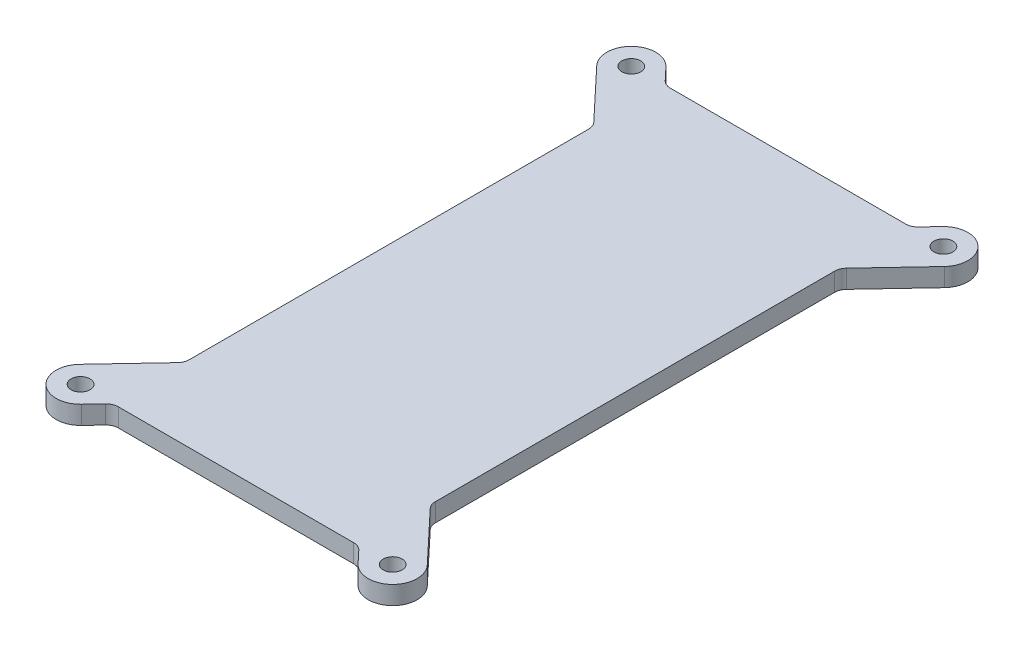
ISO-10303-21;
HEADER;
FILE_DESCRIPTION(('STEP AP214'),'2;1');
FILE_NAME('part.step','',(''),(''),'','','');
FILE_SCHEMA(('AUTOMOTIVE_DESIGN { 1 0 10303 214 1 1 1 1 }'));
ENDSEC;
DATA;
#1=APPLICATION_CONTEXT('core data for automotive mechanical design processes');
#2=APPLICATION_PROTOCOL_DEFINITION('international standard','automotive_design',2000,#1);
#3=PRODUCT_CONTEXT('',#1,'mechanical');
#4=PRODUCT('Part','Part','',(#3));
#5=PRODUCT_RELATED_PRODUCT_CATEGORY('part','',(#4));
#6=PRODUCT_DEFINITION_FORMATION('','',#4);
#7=PRODUCT_DEFINITION_CONTEXT('part definition',#1,'design');
#8=PRODUCT_DEFINITION('design','',#6,#7);
#9=PRODUCT_DEFINITION_SHAPE('','',#8);
#10=(LENGTH_UNIT() NAMED_UNIT(*) SI_UNIT(.MILLI.,.METRE.));
#11=(NAMED_UNIT(*) PLANE_ANGLE_UNIT() SI_UNIT($,.RADIAN.));
#12=(NAMED_UNIT(*) SI_UNIT($,.STERADIAN.) SOLID_ANGLE_UNIT());
#13=UNCERTAINTY_MEASURE_WITH_UNIT(LENGTH_MEASURE(1.E-05),#10,'distance_accuracy_value','');
#14=(GEOMETRIC_REPRESENTATION_CONTEXT(3) GLOBAL_UNCERTAINTY_ASSIGNED_CONTEXT((#13)) GLOBAL_UNIT_ASSIGNED_CONTEXT((#10,
#11,#12)) REPRESENTATION_CONTEXT('',''));
#15=CARTESIAN_POINT('',(0.,0.,0.));
#16=DIRECTION('',(0.,0.,1.));
#17=DIRECTION('',(1.,0.,0.));
#18=AXIS2_PLACEMENT_3D('',#15,#16,#17);
#19=CARTESIAN_POINT('',(-22.1,1.4999999999999,-32.6367571985607));
#20=DIRECTION('',(0.,-1.,0.));
#21=DIRECTION('',(0.,0.,-1.));
#22=AXIS2_PLACEMENT_3D('',#19,#20,#21);
#23=CYLINDRICAL_SURFACE('',#22,2.);
#24=DIRECTION('',(0.,1.,0.));
#25=VECTOR('',#24,1.);
#26=CARTESIAN_POINT('',(-20.6439084639172,19.6873457283229,-34.0078142500899));
#27=LINE('',#26,#25);
#28=CARTESIAN_POINT('',(-20.6439084639172,-1.5,-34.0078142500899));
#29=VERTEX_POINT('',#28);
#30=CARTESIAN_POINT('',(-20.6439084639172,1.5,-34.0078142500899));
#31=VERTEX_POINT('',#30);
#32=EDGE_CURVE('E243',#29,#31,#27,.T.);
#33=ORIENTED_EDGE('',*,*,#32,.F.);
#34=CARTESIAN_POINT('',(-22.1,-1.5,-32.6367571985607));
#35=DIRECTION('',(0.,-1.,0.));
#36=DIRECTION('',(0.,0.,-1.));
#37=AXIS2_PLACEMENT_3D('',#34,#35,#36);
#38=CIRCLE('',#37,2.);
#39=CARTESIAN_POINT('',(-20.1,-1.5,-32.6367571985607));
#40=VERTEX_POINT('',#39);
#41=EDGE_CURVE('E19',#40,#29,#38,.F.);
#42=ORIENTED_EDGE('',*,*,#41,.F.);
#43=DIRECTION('',(0.,1.,0.));
#44=VECTOR('',#43,1.);
#45=CARTESIAN_POINT('',(-20.1,1.5,-32.6367571985607));
#46=LINE('',#45,#44);
#47=CARTESIAN_POINT('',(-20.1,1.5,-32.6367571985607));
#48=VERTEX_POINT('',#47);
#49=EDGE_CURVE('E240',#40,#48,#46,.T.);
#50=ORIENTED_EDGE('',*,*,#49,.T.);
#51=CARTESIAN_POINT('',(-22.1,1.5,-32.6367571985607));
#52=DIRECTION('',(0.,-1.,0.));
#53=DIRECTION('',(0.,0.,-1.));
#54=AXIS2_PLACEMENT_3D('',#51,#52,#53);
#55=CIRCLE('',#54,2.);
#56=EDGE_CURVE('E316',#48,#31,#55,.F.);
#57=ORIENTED_EDGE('',*,*,#56,.T.);
#58=EDGE_LOOP('',(#33,#42,#50,#57));
#59=FACE_BOUND('',#58,.T.);
#60=ADVANCED_FACE('F16',(#59),#23,.F.);
#61=CARTESIAN_POINT('',(-22.1,19.687345728323,32.6367571985607));
#62=DIRECTION('',(0.,-1.,0.));
#63=DIRECTION('',(0.,0.,-1.));
#64=AXIS2_PLACEMENT_3D('',#61,#62,#63);
#65=CYLINDRICAL_SURFACE('',#64,2.);
#66=DIRECTION('',(0.,1.,0.));
#67=VECTOR('',#66,1.);
#68=CARTESIAN_POINT('',(-20.1,1.5,32.6367571985607));
#69=LINE('',#68,#67);
#70=CARTESIAN_POINT('',(-20.1,1.5,32.6367571985607));
#71=VERTEX_POINT('',#70);
#72=CARTESIAN_POINT('',(-20.1,-1.5,32.6367571985607));
#73=VERTEX_POINT('',#72);
#74=EDGE_CURVE('E353',#71,#73,#69,.F.);
#75=ORIENTED_EDGE('',*,*,#74,.T.);
#76=CARTESIAN_POINT('',(-22.1,-1.5,32.6367571985607));
#77=DIRECTION('',(0.,-1.,0.));
#78=DIRECTION('',(0.,0.,-1.));
#79=AXIS2_PLACEMENT_3D('',#76,#77,#78);
#80=CIRCLE('',#79,2.);
#81=CARTESIAN_POINT('',(-20.6439084639172,-1.5,34.0078142500899));
#82=VERTEX_POINT('',#81);
#83=EDGE_CURVE('E341',#82,#73,#80,.F.);
#84=ORIENTED_EDGE('',*,*,#83,.F.);
#85=DIRECTION('',(0.,1.,0.));
#86=VECTOR('',#85,1.);
#87=CARTESIAN_POINT('',(-20.6439084639172,19.6873457283229,34.0078142500899));
#88=LINE('',#87,#86);
#89=CARTESIAN_POINT('',(-20.6439084639172,1.5,34.0078142500899));
#90=VERTEX_POINT('',#89);
#91=EDGE_CURVE('E236',#90,#82,#88,.F.);
#92=ORIENTED_EDGE('',*,*,#91,.F.);
#93=CARTESIAN_POINT('',(-22.1,1.5,32.6367571985607));
#94=DIRECTION('',(0.,-1.,0.));
#95=DIRECTION('',(0.,0.,-1.));
#96=AXIS2_PLACEMENT_3D('',#93,#94,#95);
#97=CIRCLE('',#96,2.);
#98=EDGE_CURVE('E319',#90,#71,#97,.F.);
#99=ORIENTED_EDGE('',*,*,#98,.T.);
#100=EDGE_LOOP('',(#75,#84,#92,#99));
#101=FACE_BOUND('',#100,.T.);
#102=ADVANCED_FACE('F354',(#101),#65,.F.);
#103=CARTESIAN_POINT('',(-19.2361216889389,0.,47.1));
#104=DIRECTION('',(0.,1.,0.));
#105=DIRECTION('',(0.,0.,1.));
#106=AXIS2_PLACEMENT_3D('',#103,#104,#105);
#107=CYLINDRICAL_SURFACE('',#106,2.);
#108=DIRECTION('',(0.,1.,0.));
#109=VECTOR('',#108,1.);
#110=CARTESIAN_POINT('',(-20.6922132250217,19.6873457283229,45.7289429484708));
#111=LINE('',#110,#109);
#112=CARTESIAN_POINT('',(-20.6922132250217,-1.5,45.7289429484708));
#113=VERTEX_POINT('',#112);
#114=CARTESIAN_POINT('',(-20.6922132250217,1.5,45.7289429484708));
#115=VERTEX_POINT('',#114);
#116=EDGE_CURVE('E232',#113,#115,#111,.T.);
#117=ORIENTED_EDGE('',*,*,#116,.F.);
#118=CARTESIAN_POINT('',(-19.2361216889389,-1.5,47.1));
#119=DIRECTION('',(0.,1.,0.));
#120=DIRECTION('',(0.,0.,1.));
#121=AXIS2_PLACEMENT_3D('',#118,#119,#120);
#122=CIRCLE('',#121,2.);
#123=CARTESIAN_POINT('',(-19.2361216889389,-1.5,45.1));
#124=VERTEX_POINT('',#123);
#125=EDGE_CURVE('E340',#124,#113,#122,.T.);
#126=ORIENTED_EDGE('',*,*,#125,.F.);
#127=DIRECTION('',(0.,1.,0.));
#128=VECTOR('',#127,1.);
#129=CARTESIAN_POINT('',(-19.2361216889389,0.,45.1));
#130=LINE('',#129,#128);
#131=CARTESIAN_POINT('',(-19.2361216889389,1.5,45.1));
#132=VERTEX_POINT('',#131);
#133=EDGE_CURVE('E228',#132,#124,#130,.F.);
#134=ORIENTED_EDGE('',*,*,#133,.F.);
#135=CARTESIAN_POINT('',(-19.2361216889389,1.5,47.1));
#136=DIRECTION('',(0.,1.,0.));
#137=DIRECTION('',(0.,0.,1.));
#138=AXIS2_PLACEMENT_3D('',#135,#136,#137);
#139=CIRCLE('',#138,2.);
#140=EDGE_CURVE('E322',#132,#115,#139,.T.);
#141=ORIENTED_EDGE('',*,*,#140,.T.);
#142=EDGE_LOOP('',(#117,#126,#134,#141));
#143=FACE_BOUND('',#142,.T.);
#144=ADVANCED_FACE('F501',(#143),#107,.F.);
#145=CARTESIAN_POINT('',(19.2361216889389,0.,47.1));
#146=DIRECTION('',(0.,-1.,0.));
#147=DIRECTION('',(0.,0.,-1.));
#148=AXIS2_PLACEMENT_3D('',#145,#146,#147);
#149=CYLINDRICAL_SURFACE('',#148,2.);
#150=DIRECTION('',(0.,1.,0.));
#151=VECTOR('',#150,1.);
#152=CARTESIAN_POINT('',(20.6922132250217,19.6873457283229,45.7289429484708));
#153=LINE('',#152,#151);
#154=CARTESIAN_POINT('',(20.6922132250217,1.5,45.7289429484708));
#155=VERTEX_POINT('',#154);
#156=CARTESIAN_POINT('',(20.6922132250217,-1.5,45.7289429484708));
#157=VERTEX_POINT('',#156);
#158=EDGE_CURVE('E223',#155,#157,#153,.F.);
#159=ORIENTED_EDGE('',*,*,#158,.F.);
#160=CARTESIAN_POINT('',(19.2361216889389,1.5,47.1));
#161=DIRECTION('',(0.,-1.,0.));
#162=DIRECTION('',(0.,0.,-1.));
#163=AXIS2_PLACEMENT_3D('',#160,#161,#162);
#164=CIRCLE('',#163,2.);
#165=CARTESIAN_POINT('',(19.2361216889389,1.5,45.1));
#166=VERTEX_POINT('',#165);
#167=EDGE_CURVE('E325',#155,#166,#164,.F.);
#168=ORIENTED_EDGE('',*,*,#167,.T.);
#169=DIRECTION('',(0.,1.,0.));
#170=VECTOR('',#169,1.);
#171=CARTESIAN_POINT('',(19.2361216889389,0.,45.1));
#172=LINE('',#171,#170);
#173=CARTESIAN_POINT('',(19.2361216889389,-1.5,45.1));
#174=VERTEX_POINT('',#173);
#175=EDGE_CURVE('E224',#174,#166,#172,.T.);
#176=ORIENTED_EDGE('',*,*,#175,.F.);
#177=CARTESIAN_POINT('',(19.2361216889389,-1.5,47.1));
#178=DIRECTION('',(0.,-1.,0.));
#179=DIRECTION('',(0.,0.,-1.));
#180=AXIS2_PLACEMENT_3D('',#177,#178,#179);
#181=CIRCLE('',#180,2.);
#182=EDGE_CURVE('E338',#157,#174,#181,.F.);
#183=ORIENTED_EDGE('',*,*,#182,.F.);
#184=EDGE_LOOP('',(#159,#168,#176,#183));
#185=FACE_BOUND('',#184,.T.);
#186=ADVANCED_FACE('F497',(#185),#149,.F.);
#187=CARTESIAN_POINT('',(22.1,1.49999999999999,32.6367571985607));
#188=DIRECTION('',(0.,-1.,0.));
#189=DIRECTION('',(0.,0.,-1.));
#190=AXIS2_PLACEMENT_3D('',#187,#188,#189);
#191=CYLINDRICAL_SURFACE('',#190,2.);
#192=DIRECTION('',(0.,1.,0.));
#193=VECTOR('',#192,1.);
#194=CARTESIAN_POINT('',(20.6439084639172,19.6873457283229,34.0078142500899));
#195=LINE('',#194,#193);
#196=CARTESIAN_POINT('',(20.6439084639172,-1.5,34.0078142500899));
#197=VERTEX_POINT('',#196);
#198=CARTESIAN_POINT('',(20.6439084639172,1.5,34.0078142500899));
#199=VERTEX_POINT('',#198);
#200=EDGE_CURVE('E219',#197,#199,#195,.T.);
#201=ORIENTED_EDGE('',*,*,#200,.F.);
#202=CARTESIAN_POINT('',(22.1,-1.5,32.6367571985607));
#203=DIRECTION('',(0.,-1.,0.));
#204=DIRECTION('',(0.,0.,-1.));
#205=AXIS2_PLACEMENT_3D('',#202,#203,#204);
#206=CIRCLE('',#205,2.);
#207=CARTESIAN_POINT('',(20.1,-1.5,32.6367571985607));
#208=VERTEX_POINT('',#207);
#209=EDGE_CURVE('E336',#208,#197,#206,.F.);
#210=ORIENTED_EDGE('',*,*,#209,.F.);
#211=DIRECTION('',(0.,-1.,0.));
#212=VECTOR('',#211,1.);
#213=CARTESIAN_POINT('',(20.1,1.5,32.6367571985607));
#214=LINE('',#213,#212);
#215=CARTESIAN_POINT('',(20.1,1.5,32.6367571985607));
#216=VERTEX_POINT('',#215);
#217=EDGE_CURVE('E215',#208,#216,#214,.F.);
#218=ORIENTED_EDGE('',*,*,#217,.T.);
#219=CARTESIAN_POINT('',(22.1,1.5,32.6367571985607));
#220=DIRECTION('',(0.,-1.,0.));
#221=DIRECTION('',(0.,0.,-1.));
#222=AXIS2_PLACEMENT_3D('',#219,#220,#221);
#223=CIRCLE('',#222,2.);
#224=EDGE_CURVE('E327',#216,#199,#223,.F.);
#225=ORIENTED_EDGE('',*,*,#224,.T.);
#226=EDGE_LOOP('',(#201,#210,#218,#225));
#227=FACE_BOUND('',#226,.T.);
#228=ADVANCED_FACE('F493',(#227),#191,.F.);
#229=CARTESIAN_POINT('',(22.1,19.6873457283229,-32.6367571985607));
#230=DIRECTION('',(0.,-1.,0.));
#231=DIRECTION('',(0.,0.,-1.));
#232=AXIS2_PLACEMENT_3D('',#229,#230,#231);
#233=CYLINDRICAL_SURFACE('',#232,2.);
#234=DIRECTION('',(0.,-1.,0.));
#235=VECTOR('',#234,1.);
#236=CARTESIAN_POINT('',(20.1,1.5,-32.6367571985607));
#237=LINE('',#236,#235);
#238=CARTESIAN_POINT('',(20.1,1.5,-32.6367571985607));
#239=VERTEX_POINT('',#238);
#240=CARTESIAN_POINT('',(20.1,-1.5,-32.6367571985607));
#241=VERTEX_POINT('',#240);
#242=EDGE_CURVE('E211',#239,#241,#237,.T.);
#243=ORIENTED_EDGE('',*,*,#242,.T.);
#244=CARTESIAN_POINT('',(22.1,-1.5,-32.6367571985607));
#245=DIRECTION('',(0.,-1.,0.));
#246=DIRECTION('',(0.,0.,-1.));
#247=AXIS2_PLACEMENT_3D('',#244,#245,#246);
#248=CIRCLE('',#247,2.);
#249=CARTESIAN_POINT('',(20.6439084639172,-1.5,-34.0078142500899));
#250=VERTEX_POINT('',#249);
#251=EDGE_CURVE('E334',#250,#241,#248,.F.);
#252=ORIENTED_EDGE('',*,*,#251,.F.);
#253=DIRECTION('',(0.,1.,0.));
#254=VECTOR('',#253,1.);
#255=CARTESIAN_POINT('',(20.6439084639172,19.6873457283229,-34.0078142500899));
#256=LINE('',#255,#254);
#257=CARTESIAN_POINT('',(20.6439084639172,1.5,-34.0078142500899));
#258=VERTEX_POINT('',#257);
#259=EDGE_CURVE('E210',#258,#250,#256,.F.);
#260=ORIENTED_EDGE('',*,*,#259,.F.);
#261=CARTESIAN_POINT('',(22.1,1.5,-32.6367571985607));
#262=DIRECTION('',(0.,-1.,0.));
#263=DIRECTION('',(0.,0.,-1.));
#264=AXIS2_PLACEMENT_3D('',#261,#262,#263);
#265=CIRCLE('',#264,2.);
#266=EDGE_CURVE('E330',#258,#239,#265,.F.);
#267=ORIENTED_EDGE('',*,*,#266,.T.);
#268=EDGE_LOOP('',(#243,#252,#260,#267));
#269=FACE_BOUND('',#268,.T.);
#270=ADVANCED_FACE('F489',(#269),#233,.F.);
#271=CARTESIAN_POINT('',(19.2361216889389,19.6873457283229,-47.1));
#272=DIRECTION('',(0.,1.,0.));
#273=DIRECTION('',(0.,0.,1.));
#274=AXIS2_PLACEMENT_3D('',#271,#272,#273);
#275=CYLINDRICAL_SURFACE('',#274,2.);
#276=DIRECTION('',(0.,1.,0.));
#277=VECTOR('',#276,1.);
#278=CARTESIAN_POINT('',(19.2361216889389,0.,-45.1));
#279=LINE('',#278,#277);
#280=CARTESIAN_POINT('',(19.2361216889389,-1.5,-45.1));
#281=VERTEX_POINT('',#280);
#282=CARTESIAN_POINT('',(19.2361216889389,1.5,-45.1));
#283=VERTEX_POINT('',#282);
#284=EDGE_CURVE('E197',#281,#283,#279,.T.);
#285=ORIENTED_EDGE('',*,*,#284,.T.);
#286=CARTESIAN_POINT('',(19.2361216889389,1.5,-47.1));
#287=DIRECTION('',(0.,1.,0.));
#288=DIRECTION('',(0.,0.,1.));
#289=AXIS2_PLACEMENT_3D('',#286,#287,#288);
#290=CIRCLE('',#289,2.);
#291=CARTESIAN_POINT('',(20.6922132250217,1.5,-45.7289429484708));
#292=VERTEX_POINT('',#291);
#293=EDGE_CURVE('E196',#283,#292,#290,.T.);
#294=ORIENTED_EDGE('',*,*,#293,.T.);
#295=DIRECTION('',(0.,1.,0.));
#296=VECTOR('',#295,1.);
#297=CARTESIAN_POINT('',(20.6922132250217,19.6873457283229,-45.7289429484708));
#298=LINE('',#297,#296);
#299=CARTESIAN_POINT('',(20.6922132250217,-1.5,-45.7289429484708));
#300=VERTEX_POINT('',#299);
#301=EDGE_CURVE('E206',#300,#292,#298,.T.);
#302=ORIENTED_EDGE('',*,*,#301,.F.);
#303=CARTESIAN_POINT('',(19.2361216889389,-1.5,-47.1));
#304=DIRECTION('',(0.,1.,0.));
#305=DIRECTION('',(0.,0.,1.));
#306=AXIS2_PLACEMENT_3D('',#303,#304,#305);
#307=CIRCLE('',#306,2.);
#308=EDGE_CURVE('E332',#281,#300,#307,.T.);
#309=ORIENTED_EDGE('',*,*,#308,.F.);
#310=EDGE_LOOP('',(#285,#294,#302,#309));
#311=FACE_BOUND('',#310,.T.);
#312=ADVANCED_FACE('F486',(#311),#275,.F.);
#313=CARTESIAN_POINT('',(-20.1,1.5,45.1));
#314=DIRECTION('',(0.,-1.,0.));
#315=DIRECTION('',(0.,0.,-1.));
#316=AXIS2_PLACEMENT_3D('',#313,#314,#315);
#317=PLANE('',#316);
#318=ORIENTED_EDGE('',*,*,#293,.F.);
#319=DIRECTION('',(1.,0.,0.));
#320=VECTOR('',#319,1.);
#321=CARTESIAN_POINT('',(0.,1.5,-45.1));
#322=LINE('',#321,#320);
#323=CARTESIAN_POINT('',(-19.2361216889389,1.5,-45.1));
#324=VERTEX_POINT('',#323);
#325=EDGE_CURVE('E187',#283,#324,#322,.F.);
#326=ORIENTED_EDGE('',*,*,#325,.T.);
#327=CARTESIAN_POINT('',(-19.2361216889389,1.5,-47.1));
#328=DIRECTION('',(0.,-1.,0.));
#329=DIRECTION('',(0.,0.,-1.));
#330=AXIS2_PLACEMENT_3D('',#327,#328,#329);
#331=CIRCLE('',#330,2.);
#332=CARTESIAN_POINT('',(-20.6922132250217,1.5,-45.7289429484708));
#333=VERTEX_POINT('',#332);
#334=EDGE_CURVE('E172',#324,#333,#331,.T.);
#335=ORIENTED_EDGE('',*,*,#334,.T.);
#336=DIRECTION('',(-0.685528525764619,0.,-0.728045768041397));
#337=VECTOR('',#336,1.);
#338=CARTESIAN_POINT('',(-20.1,1.5,-45.1));
#339=LINE('',#338,#337);
#340=CARTESIAN_POINT('',(-22.5878169278344,1.5,-47.7421141030585));
#341=VERTEX_POINT('',#340);
#342=EDGE_CURVE('E190',#341,#333,#339,.F.);
#343=ORIENTED_EDGE('',*,*,#342,.F.);
#344=CARTESIAN_POINT('',(-25.5,1.5,-45.));
#345=DIRECTION('',(0.,-1.,0.));
#346=DIRECTION('',(0.,0.,-1.));
#347=AXIS2_PLACEMENT_3D('',#344,#345,#346);
#348=CIRCLE('',#347,4.);
#349=CARTESIAN_POINT('',(-28.4121830721656,1.5,-42.2578858969415));
#350=VERTEX_POINT('',#349);
#351=EDGE_CURVE('E293',#350,#341,#348,.T.);
#352=ORIENTED_EDGE('',*,*,#351,.F.);
#353=DIRECTION('',(0.685528525764621,0.,0.728045768041396));
#354=VECTOR('',#353,1.);
#355=CARTESIAN_POINT('',(-28.4121830721656,1.5,-42.2578858969415));
#356=LINE('',#355,#354);
#357=EDGE_CURVE('E241',#31,#350,#356,.F.);
#358=ORIENTED_EDGE('',*,*,#357,.F.);
#359=ORIENTED_EDGE('',*,*,#56,.F.);
#360=DIRECTION('',(0.,0.,1.));
#361=VECTOR('',#360,1.);
#362=CARTESIAN_POINT('',(-20.1,1.5,45.1));
#363=LINE('',#362,#361);
#364=EDGE_CURVE('E237',#48,#71,#363,.T.);
#365=ORIENTED_EDGE('',*,*,#364,.T.);
#366=ORIENTED_EDGE('',*,*,#98,.F.);
#367=DIRECTION('',(-0.685528525764621,0.,0.728045768041396));
#368=VECTOR('',#367,1.);
#369=CARTESIAN_POINT('',(-28.4121830721656,1.5,42.2578858969415));
#370=LINE('',#369,#368);
#371=CARTESIAN_POINT('',(-28.4121830721656,1.5,42.2578858969415));
#372=VERTEX_POINT('',#371);
#373=EDGE_CURVE('E233',#372,#90,#370,.F.);
#374=ORIENTED_EDGE('',*,*,#373,.F.);
#375=CARTESIAN_POINT('',(-25.5,1.5,45.));
#376=DIRECTION('',(0.,-1.,0.));
#377=DIRECTION('',(0.,0.,-1.));
#378=AXIS2_PLACEMENT_3D('',#375,#376,#377);
#379=CIRCLE('',#378,4.);
#380=CARTESIAN_POINT('',(-22.5878169278344,1.5,47.7421141030585));
#381=VERTEX_POINT('',#380);
#382=EDGE_CURVE('E290',#381,#372,#379,.T.);
#383=ORIENTED_EDGE('',*,*,#382,.F.);
#384=DIRECTION('',(0.685528525764619,0.,-0.728045768041397));
#385=VECTOR('',#384,1.);
#386=CARTESIAN_POINT('',(-20.1,1.5,45.1));
#387=LINE('',#386,#385);
#388=EDGE_CURVE('E230',#115,#381,#387,.F.);
#389=ORIENTED_EDGE('',*,*,#388,.F.);
#390=ORIENTED_EDGE('',*,*,#140,.F.);
#391=DIRECTION('',(1.,0.,0.));
#392=VECTOR('',#391,1.);
#393=CARTESIAN_POINT('',(0.,1.5,45.1));
#394=LINE('',#393,#392);
#395=EDGE_CURVE('E225',#166,#132,#394,.F.);
#396=ORIENTED_EDGE('',*,*,#395,.F.);
#397=ORIENTED_EDGE('',*,*,#167,.F.);
#398=DIRECTION('',(0.685528525764619,0.,0.728045768041397));
#399=VECTOR('',#398,1.);
#400=CARTESIAN_POINT('',(20.1,1.5,45.1));
#401=LINE('',#400,#399);
#402=CARTESIAN_POINT('',(22.5878169278344,1.5,47.7421141030585));
#403=VERTEX_POINT('',#402);
#404=EDGE_CURVE('E220',#403,#155,#401,.F.);
#405=ORIENTED_EDGE('',*,*,#404,.F.);
#406=CARTESIAN_POINT('',(25.5,1.5,45.));
#407=DIRECTION('',(0.,-1.,0.));
#408=DIRECTION('',(0.,0.,-1.));
#409=AXIS2_PLACEMENT_3D('',#406,#407,#408);
#410=CIRCLE('',#409,4.);
#411=CARTESIAN_POINT('',(28.4121830721656,1.5,42.2578858969415));
#412=VERTEX_POINT('',#411);
#413=EDGE_CURVE('E287',#412,#403,#410,.T.);
#414=ORIENTED_EDGE('',*,*,#413,.F.);
#415=DIRECTION('',(-0.685528525764621,0.,-0.728045768041396));
#416=VECTOR('',#415,1.);
#417=CARTESIAN_POINT('',(28.4121830721656,1.5,42.2578858969415));
#418=LINE('',#417,#416);
#419=EDGE_CURVE('E216',#199,#412,#418,.F.);
#420=ORIENTED_EDGE('',*,*,#419,.F.);
#421=ORIENTED_EDGE('',*,*,#224,.F.);
#422=DIRECTION('',(0.,0.,1.));
#423=VECTOR('',#422,1.);
#424=CARTESIAN_POINT('',(20.1,1.5,45.1));
#425=LINE('',#424,#423);
#426=EDGE_CURVE('E212',#216,#239,#425,.F.);
#427=ORIENTED_EDGE('',*,*,#426,.T.);
#428=ORIENTED_EDGE('',*,*,#266,.F.);
#429=DIRECTION('',(0.685528525764621,0.,-0.728045768041396));
#430=VECTOR('',#429,1.);
#431=CARTESIAN_POINT('',(28.4121830721656,1.5,-42.2578858969415));
#432=LINE('',#431,#430);
#433=CARTESIAN_POINT('',(28.4121830721656,1.5,-42.2578858969415));
#434=VERTEX_POINT('',#433);
#435=EDGE_CURVE('E207',#434,#258,#432,.F.);
#436=ORIENTED_EDGE('',*,*,#435,.F.);
#437=CARTESIAN_POINT('',(25.5,1.5,-45.));
#438=DIRECTION('',(0.,-1.,0.));
#439=DIRECTION('',(0.,0.,-1.));
#440=AXIS2_PLACEMENT_3D('',#437,#438,#439);
#441=CIRCLE('',#440,4.);
#442=CARTESIAN_POINT('',(22.5878169278344,1.5,-47.7421141030585));
#443=VERTEX_POINT('',#442);
#444=EDGE_CURVE('E284',#443,#434,#441,.T.);
#445=ORIENTED_EDGE('',*,*,#444,.F.);
#446=DIRECTION('',(-0.68552852576462,0.,0.728045768041396));
#447=VECTOR('',#446,1.);
#448=CARTESIAN_POINT('',(20.1,1.5,-45.1));
#449=LINE('',#448,#447);
#450=EDGE_CURVE('E204',#292,#443,#449,.F.);
#451=ORIENTED_EDGE('',*,*,#450,.F.);
#452=EDGE_LOOP('',(#318,#326,#335,#343,#352,#358,#359,#365,#366,#374,#383,#389,#390,#396,#397,
#405,#414,#420,#421,#427,#428,#436,#445,#451));
#453=FACE_BOUND('',#452,.T.);
#454=CARTESIAN_POINT('',(-25.5,1.5,45.));
#455=DIRECTION('',(0.,-1.,0.));
#456=DIRECTION('',(0.,0.,-1.));
#457=AXIS2_PLACEMENT_3D('',#454,#455,#456);
#458=CIRCLE('',#457,1.55);
#459=CARTESIAN_POINT('',(-25.5,1.5,43.45));
#460=VERTEX_POINT('',#459);
#461=EDGE_CURVE('E295',#460,#460,#458,.T.);
#462=ORIENTED_EDGE('',*,*,#461,.T.);
#463=EDGE_LOOP('',(#462));
#464=FACE_BOUND('',#463,.T.);
#465=CARTESIAN_POINT('',(25.5,1.5,-45.));
#466=DIRECTION('',(0.,-1.,0.));
#467=DIRECTION('',(0.,0.,-1.));
#468=AXIS2_PLACEMENT_3D('',#465,#466,#467);
#469=CIRCLE('',#468,1.55);
#470=CARTESIAN_POINT('',(25.5,1.5,-46.55));
#471=VERTEX_POINT('',#470);
#472=EDGE_CURVE('E298',#471,#471,#469,.T.);
#473=ORIENTED_EDGE('',*,*,#472,.T.);
#474=EDGE_LOOP('',(#473));
#475=FACE_BOUND('',#474,.T.);
#476=CARTESIAN_POINT('',(-25.5,1.5,-45.));
#477=DIRECTION('',(0.,-1.,0.));
#478=DIRECTION('',(0.,0.,-1.));
#479=AXIS2_PLACEMENT_3D('',#476,#477,#478);
#480=CIRCLE('',#479,1.55);
#481=CARTESIAN_POINT('',(-25.5,1.5,-46.55));
#482=VERTEX_POINT('',#481);
#483=EDGE_CURVE('E303',#482,#482,#480,.T.);
#484=ORIENTED_EDGE('',*,*,#483,.T.);
#485=EDGE_LOOP('',(#484));
#486=FACE_BOUND('',#485,.T.);
#487=CARTESIAN_POINT('',(25.5,1.5,45.));
#488=DIRECTION('',(0.,-1.,0.));
#489=DIRECTION('',(0.,0.,-1.));
#490=AXIS2_PLACEMENT_3D('',#487,#488,#489);
#491=CIRCLE('',#490,1.55);
#492=CARTESIAN_POINT('',(25.5,1.5,43.45));
#493=VERTEX_POINT('',#492);
#494=EDGE_CURVE('E181',#493,#493,#491,.T.);
#495=ORIENTED_EDGE('',*,*,#494,.T.);
#496=EDGE_LOOP('',(#495));
#497=FACE_BOUND('',#496,.T.);
#498=ADVANCED_FACE('F192',(#453,#464,#475,#486,#497),#317,.F.);
#499=CARTESIAN_POINT('',(-19.2361216889389,19.6873457283229,-47.1));
#500=DIRECTION('',(0.,-1.,0.));
#501=DIRECTION('',(0.,0.,-1.));
#502=AXIS2_PLACEMENT_3D('',#499,#500,#501);
#503=CYLINDRICAL_SURFACE('',#502,2.);
#504=DIRECTION('',(0.,1.,0.));
#505=VECTOR('',#504,1.);
#506=CARTESIAN_POINT('',(-19.2361216889389,0.,-45.1));
#507=LINE('',#506,#505);
#508=CARTESIAN_POINT('',(-19.2361216889389,-1.5,-45.1));
#509=VERTEX_POINT('',#508);
#510=EDGE_CURVE('E175',#324,#509,#507,.F.);
#511=ORIENTED_EDGE('',*,*,#510,.T.);
#512=CARTESIAN_POINT('',(-19.2361216889389,-1.5,-47.1));
#513=DIRECTION('',(0.,-1.,0.));
#514=DIRECTION('',(0.,0.,-1.));
#515=AXIS2_PLACEMENT_3D('',#512,#513,#514);
#516=CIRCLE('',#515,2.);
#517=CARTESIAN_POINT('',(-20.6922132250217,-1.5,-45.7289429484708));
#518=VERTEX_POINT('',#517);
#519=EDGE_CURVE('E34',#518,#509,#516,.F.);
#520=ORIENTED_EDGE('',*,*,#519,.F.);
#521=DIRECTION('',(0.,1.,0.));
#522=VECTOR('',#521,1.);
#523=CARTESIAN_POINT('',(-20.6922132250217,19.6873457283229,-45.7289429484708));
#524=LINE('',#523,#522);
#525=EDGE_CURVE('E177',#333,#518,#524,.F.);
#526=ORIENTED_EDGE('',*,*,#525,.F.);
#527=ORIENTED_EDGE('',*,*,#334,.F.);
#528=EDGE_LOOP('',(#511,#520,#526,#527));
#529=FACE_BOUND('',#528,.T.);
#530=ADVANCED_FACE('F174',(#529),#503,.F.);
#531=CARTESIAN_POINT('',(25.5,1.5,45.));
#532=DIRECTION('',(0.,-1.,0.));
#533=DIRECTION('',(0.,0.,-1.));
#534=AXIS2_PLACEMENT_3D('',#531,#532,#533);
#535=CYLINDRICAL_SURFACE('',#534,1.55);
#536=CARTESIAN_POINT('',(25.5,-1.5,45.));
#537=DIRECTION('',(0.,-1.,0.));
#538=DIRECTION('',(0.,0.,-1.));
#539=AXIS2_PLACEMENT_3D('',#536,#537,#538);
#540=CIRCLE('',#539,1.55);
#541=CARTESIAN_POINT('',(25.5,-1.5,43.45));
#542=VERTEX_POINT('',#541);
#543=EDGE_CURVE('E276',#542,#542,#540,.T.);
#544=ORIENTED_EDGE('',*,*,#543,.T.);
#545=EDGE_LOOP('',(#544));
#546=FACE_BOUND('',#545,.T.);
#547=ORIENTED_EDGE('',*,*,#494,.F.);
#548=EDGE_LOOP('',(#547));
#549=FACE_BOUND('',#548,.T.);
#550=ADVANCED_FACE('F477',(#546,#549),#535,.F.);
#551=CARTESIAN_POINT('',(-25.5,1.5,-45.));
#552=DIRECTION('',(0.,-1.,0.));
#553=DIRECTION('',(0.,0.,-1.));
#554=AXIS2_PLACEMENT_3D('',#551,#552,#553);
#555=CYLINDRICAL_SURFACE('',#554,1.55);
#556=CARTESIAN_POINT('',(-25.5,-1.5,-45.));
#557=DIRECTION('',(0.,-1.,0.));
#558=DIRECTION('',(0.,0.,-1.));
#559=AXIS2_PLACEMENT_3D('',#556,#557,#558);
#560=CIRCLE('',#559,1.55);
#561=CARTESIAN_POINT('',(-25.5,-1.5,-46.55));
#562=VERTEX_POINT('',#561);
#563=EDGE_CURVE('E271',#562,#562,#560,.T.);
#564=ORIENTED_EDGE('',*,*,#563,.T.);
#565=EDGE_LOOP('',(#564));
#566=FACE_BOUND('',#565,.T.);
#567=ORIENTED_EDGE('',*,*,#483,.F.);
#568=EDGE_LOOP('',(#567));
#569=FACE_BOUND('',#568,.T.);
#570=ADVANCED_FACE('F473',(#566,#569),#555,.F.);
#571=CARTESIAN_POINT('',(25.5,1.5,-45.));
#572=DIRECTION('',(0.,-1.,0.));
#573=DIRECTION('',(0.,0.,-1.));
#574=AXIS2_PLACEMENT_3D('',#571,#572,#573);
#575=CYLINDRICAL_SURFACE('',#574,1.55);
#576=CARTESIAN_POINT('',(25.5,-1.5,-45.));
#577=DIRECTION('',(0.,-1.,0.));
#578=DIRECTION('',(0.,0.,-1.));
#579=AXIS2_PLACEMENT_3D('',#576,#577,#578);
#580=CIRCLE('',#579,1.55);
#581=CARTESIAN_POINT('',(25.5,-1.5,-46.55));
#582=VERTEX_POINT('',#581);
#583=EDGE_CURVE('E266',#582,#582,#580,.T.);
#584=ORIENTED_EDGE('',*,*,#583,.T.);
#585=EDGE_LOOP('',(#584));
#586=FACE_BOUND('',#585,.T.);
#587=ORIENTED_EDGE('',*,*,#472,.F.);
#588=EDGE_LOOP('',(#587));
#589=FACE_BOUND('',#588,.T.);
#590=ADVANCED_FACE('F469',(#586,#589),#575,.F.);
#591=CARTESIAN_POINT('',(-25.5,1.5,45.));
#592=DIRECTION('',(0.,-1.,0.));
#593=DIRECTION('',(0.,0.,-1.));
#594=AXIS2_PLACEMENT_3D('',#591,#592,#593);
#595=CYLINDRICAL_SURFACE('',#594,1.55);
#596=CARTESIAN_POINT('',(-25.5,-1.5,45.));
#597=DIRECTION('',(0.,-1.,0.));
#598=DIRECTION('',(0.,0.,-1.));
#599=AXIS2_PLACEMENT_3D('',#596,#597,#598);
#600=CIRCLE('',#599,1.55);
#601=CARTESIAN_POINT('',(-25.5,-1.5,43.45));
#602=VERTEX_POINT('',#601);
#603=EDGE_CURVE('E263',#602,#602,#600,.T.);
#604=ORIENTED_EDGE('',*,*,#603,.T.);
#605=EDGE_LOOP('',(#604));
#606=FACE_BOUND('',#605,.T.);
#607=ORIENTED_EDGE('',*,*,#461,.F.);
#608=EDGE_LOOP('',(#607));
#609=FACE_BOUND('',#608,.T.);
#610=ADVANCED_FACE('F466',(#606,#609),#595,.F.);
#611=CARTESIAN_POINT('',(-25.5,19.6873457283229,-45.));
#612=DIRECTION('',(0.,-1.,0.));
#613=DIRECTION('',(0.,0.,-1.));
#614=AXIS2_PLACEMENT_3D('',#611,#612,#613);
#615=CYLINDRICAL_SURFACE('',#614,4.);
#616=CARTESIAN_POINT('',(-25.5,-1.5,-45.));
#617=DIRECTION('',(0.,-1.,0.));
#618=DIRECTION('',(0.,0.,-1.));
#619=AXIS2_PLACEMENT_3D('',#616,#617,#618);
#620=CIRCLE('',#619,4.);
#621=CARTESIAN_POINT('',(-22.5878169278344,-1.5,-47.7421141030585));
#622=VERTEX_POINT('',#621);
#623=CARTESIAN_POINT('',(-28.4121830721656,-1.5,-42.2578858969415));
#624=VERTEX_POINT('',#623);
#625=EDGE_CURVE('E259',#622,#624,#620,.F.);
#626=ORIENTED_EDGE('',*,*,#625,.T.);
#627=DIRECTION('',(0.,1.,0.));
#628=VECTOR('',#627,1.);
#629=CARTESIAN_POINT('',(-28.4121830721656,19.6873457283229,-42.2578858969415));
#630=LINE('',#629,#628);
#631=EDGE_CURVE('E150',#350,#624,#630,.F.);
#632=ORIENTED_EDGE('',*,*,#631,.F.);
#633=ORIENTED_EDGE('',*,*,#351,.T.);
#634=DIRECTION('',(0.,1.,0.));
#635=VECTOR('',#634,1.);
#636=CARTESIAN_POINT('',(-22.5878169278344,19.6873457283229,-47.7421141030585));
#637=LINE('',#636,#635);
#638=EDGE_CURVE('E281',#622,#341,#637,.T.);
#639=ORIENTED_EDGE('',*,*,#638,.F.);
#640=EDGE_LOOP('',(#626,#632,#633,#639));
#641=FACE_BOUND('',#640,.T.);
#642=ADVANCED_FACE('F402',(#641),#615,.T.);
#643=CARTESIAN_POINT('',(-28.4121830721656,19.6873457283229,-42.2578858969415));
#644=DIRECTION('',(-0.728045768041396,0.,0.685528525764621));
#645=DIRECTION('',(0.685528525764621,0.,0.728045768041396));
#646=AXIS2_PLACEMENT_3D('',#643,#644,#645);
#647=PLANE('',#646);
#648=ORIENTED_EDGE('',*,*,#357,.T.);
#649=ORIENTED_EDGE('',*,*,#631,.T.);
#650=DIRECTION('',(0.685528525764621,0.,0.728045768041396));
#651=VECTOR('',#650,1.);
#652=CARTESIAN_POINT('',(-28.4121830721656,-1.5,-42.2578858969415));
#653=LINE('',#652,#651);
#654=EDGE_CURVE('E262',#624,#29,#653,.T.);
#655=ORIENTED_EDGE('',*,*,#654,.T.);
#656=ORIENTED_EDGE('',*,*,#32,.T.);
#657=EDGE_LOOP('',(#648,#649,#655,#656));
#658=FACE_BOUND('',#657,.T.);
#659=ADVANCED_FACE('F396',(#658),#647,.T.);
#660=CARTESIAN_POINT('',(-20.1,1.5,45.1));
#661=DIRECTION('',(1.,0.,0.));
#662=DIRECTION('',(0.,1.,0.));
#663=AXIS2_PLACEMENT_3D('',#660,#661,#662);
#664=PLANE('',#663);
#665=ORIENTED_EDGE('',*,*,#49,.F.);
#666=DIRECTION('',(0.,0.,1.));
#667=VECTOR('',#666,1.);
#668=CARTESIAN_POINT('',(-20.1,-1.5,45.1));
#669=LINE('',#668,#667);
#670=EDGE_CURVE('E347',#40,#73,#669,.T.);
#671=ORIENTED_EDGE('',*,*,#670,.T.);
#672=ORIENTED_EDGE('',*,*,#74,.F.);
#673=ORIENTED_EDGE('',*,*,#364,.F.);
#674=EDGE_LOOP('',(#665,#671,#672,#673));
#675=FACE_BOUND('',#674,.T.);
#676=ADVANCED_FACE('F358',(#675),#664,.F.);
#677=CARTESIAN_POINT('',(-28.4121830721656,19.6873457283229,42.2578858969415));
#678=DIRECTION('',(-0.728045768041396,0.,-0.685528525764621));
#679=DIRECTION('',(-0.685528525764621,0.,0.728045768041396));
#680=AXIS2_PLACEMENT_3D('',#677,#678,#679);
#681=PLANE('',#680);
#682=DIRECTION('',(-0.685528525764621,0.,0.728045768041396));
#683=VECTOR('',#682,1.);
#684=CARTESIAN_POINT('',(-20.6439084639172,-1.5,34.0078142500899));
#685=LINE('',#684,#683);
#686=CARTESIAN_POINT('',(-28.4121830721656,-1.5,42.2578858969415));
#687=VERTEX_POINT('',#686);
#688=EDGE_CURVE('E258',#82,#687,#685,.T.);
#689=ORIENTED_EDGE('',*,*,#688,.T.);
#690=DIRECTION('',(0.,-1.,0.));
#691=VECTOR('',#690,1.);
#692=CARTESIAN_POINT('',(-28.4121830721656,19.6873457283229,42.2578858969415));
#693=LINE('',#692,#691);
#694=EDGE_CURVE('E292',#372,#687,#693,.T.);
#695=ORIENTED_EDGE('',*,*,#694,.F.);
#696=ORIENTED_EDGE('',*,*,#373,.T.);
#697=ORIENTED_EDGE('',*,*,#91,.T.);
#698=EDGE_LOOP('',(#689,#695,#696,#697));
#699=FACE_BOUND('',#698,.T.);
#700=ADVANCED_FACE('F455',(#699),#681,.T.);
#701=CARTESIAN_POINT('',(-25.5,19.6873457283229,45.));
#702=DIRECTION('',(0.,-1.,0.));
#703=DIRECTION('',(0.,0.,-1.));
#704=AXIS2_PLACEMENT_3D('',#701,#702,#703);
#705=CYLINDRICAL_SURFACE('',#704,4.);
#706=CARTESIAN_POINT('',(-25.5,-1.5,45.));
#707=DIRECTION('',(0.,-1.,0.));
#708=DIRECTION('',(0.,0.,-1.));
#709=AXIS2_PLACEMENT_3D('',#706,#707,#708);
#710=CIRCLE('',#709,4.);
#711=CARTESIAN_POINT('',(-22.5878169278344,-1.5,47.7421141030585));
#712=VERTEX_POINT('',#711);
#713=EDGE_CURVE('E254',#687,#712,#710,.F.);
#714=ORIENTED_EDGE('',*,*,#713,.T.);
#715=DIRECTION('',(0.,1.,0.));
#716=VECTOR('',#715,1.);
#717=CARTESIAN_POINT('',(-22.5878169278344,19.6873457283229,47.7421141030585));
#718=LINE('',#717,#716);
#719=EDGE_CURVE('E229',#381,#712,#718,.F.);
#720=ORIENTED_EDGE('',*,*,#719,.F.);
#721=ORIENTED_EDGE('',*,*,#382,.T.);
#722=ORIENTED_EDGE('',*,*,#694,.T.);
#723=EDGE_LOOP('',(#714,#720,#721,#722));
#724=FACE_BOUND('',#723,.T.);
#725=ADVANCED_FACE('F451',(#724),#705,.T.);
#726=CARTESIAN_POINT('',(-20.1,19.6873457283229,45.1));
#727=DIRECTION('',(0.728045768041397,0.,0.685528525764619));
#728=DIRECTION('',(0.685528525764619,0.,-0.728045768041397));
#729=AXIS2_PLACEMENT_3D('',#726,#727,#728);
#730=PLANE('',#729);
#731=ORIENTED_EDGE('',*,*,#388,.T.);
#732=ORIENTED_EDGE('',*,*,#719,.T.);
#733=DIRECTION('',(0.685528525764618,0.,-0.728045768041399));
#734=VECTOR('',#733,1.);
#735=CARTESIAN_POINT('',(-22.5878169278344,-1.5,47.7421141030585));
#736=LINE('',#735,#734);
#737=EDGE_CURVE('E257',#712,#113,#736,.T.);
#738=ORIENTED_EDGE('',*,*,#737,.T.);
#739=ORIENTED_EDGE('',*,*,#116,.T.);
#740=EDGE_LOOP('',(#731,#732,#738,#739));
#741=FACE_BOUND('',#740,.T.);
#742=ADVANCED_FACE('F447',(#741),#730,.T.);
#743=CARTESIAN_POINT('',(0.,0.,45.1));
#744=DIRECTION('',(0.,0.,1.));
#745=DIRECTION('',(1.,0.,0.));
#746=AXIS2_PLACEMENT_3D('',#743,#744,#745);
#747=PLANE('',#746);
#748=DIRECTION('',(1.,0.,0.));
#749=VECTOR('',#748,1.);
#750=CARTESIAN_POINT('',(-20.1,-1.5,45.1));
#751=LINE('',#750,#749);
#752=EDGE_CURVE('E703',#124,#174,#751,.T.);
#753=ORIENTED_EDGE('',*,*,#752,.T.);
#754=ORIENTED_EDGE('',*,*,#175,.T.);
#755=ORIENTED_EDGE('',*,*,#395,.T.);
#756=ORIENTED_EDGE('',*,*,#133,.T.);
#757=EDGE_LOOP('',(#753,#754,#755,#756));
#758=FACE_BOUND('',#757,.T.);
#759=ADVANCED_FACE('F443',(#758),#747,.T.);
#760=CARTESIAN_POINT('',(20.1,19.6873457283229,45.1));
#761=DIRECTION('',(-0.728045768041397,0.,0.685528525764619));
#762=DIRECTION('',(0.685528525764619,0.,0.728045768041397));
#763=AXIS2_PLACEMENT_3D('',#760,#761,#762);
#764=PLANE('',#763);
#765=DIRECTION('',(0.685528525764619,0.,0.728045768041397));
#766=VECTOR('',#765,1.);
#767=CARTESIAN_POINT('',(20.6922132250217,-1.5,45.7289429484708));
#768=LINE('',#767,#766);
#769=CARTESIAN_POINT('',(22.5878169278344,-1.5,47.7421141030585));
#770=VERTEX_POINT('',#769);
#771=EDGE_CURVE('E253',#157,#770,#768,.T.);
#772=ORIENTED_EDGE('',*,*,#771,.T.);
#773=DIRECTION('',(0.,-1.,0.));
#774=VECTOR('',#773,1.);
#775=CARTESIAN_POINT('',(22.5878169278344,19.6873457283229,47.7421141030585));
#776=LINE('',#775,#774);
#777=EDGE_CURVE('E289',#403,#770,#776,.T.);
#778=ORIENTED_EDGE('',*,*,#777,.F.);
#779=ORIENTED_EDGE('',*,*,#404,.T.);
#780=ORIENTED_EDGE('',*,*,#158,.T.);
#781=EDGE_LOOP('',(#772,#778,#779,#780));
#782=FACE_BOUND('',#781,.T.);
#783=ADVANCED_FACE('F439',(#782),#764,.T.);
#784=CARTESIAN_POINT('',(25.5,19.6873457283229,45.));
#785=DIRECTION('',(0.,-1.,0.));
#786=DIRECTION('',(0.,0.,-1.));
#787=AXIS2_PLACEMENT_3D('',#784,#785,#786);
#788=CYLINDRICAL_SURFACE('',#787,4.);
#789=CARTESIAN_POINT('',(25.5,-1.5,45.));
#790=DIRECTION('',(0.,-1.,0.));
#791=DIRECTION('',(0.,0.,-1.));
#792=AXIS2_PLACEMENT_3D('',#789,#790,#791);
#793=CIRCLE('',#792,4.);
#794=CARTESIAN_POINT('',(28.4121830721656,-1.5,42.2578858969415));
#795=VERTEX_POINT('',#794);
#796=EDGE_CURVE('E249',#770,#795,#793,.F.);
#797=ORIENTED_EDGE('',*,*,#796,.T.);
#798=DIRECTION('',(0.,1.,0.));
#799=VECTOR('',#798,1.);
#800=CARTESIAN_POINT('',(28.4121830721656,19.6873457283229,42.2578858969415));
#801=LINE('',#800,#799);
#802=EDGE_CURVE('E218',#412,#795,#801,.F.);
#803=ORIENTED_EDGE('',*,*,#802,.F.);
#804=ORIENTED_EDGE('',*,*,#413,.T.);
#805=ORIENTED_EDGE('',*,*,#777,.T.);
#806=EDGE_LOOP('',(#797,#803,#804,#805));
#807=FACE_BOUND('',#806,.T.);
#808=ADVANCED_FACE('F435',(#807),#788,.T.);
#809=CARTESIAN_POINT('',(28.4121830721656,19.6873457283229,42.2578858969415));
#810=DIRECTION('',(0.728045768041396,0.,-0.685528525764621));
#811=DIRECTION('',(-0.685528525764621,0.,-0.728045768041396));
#812=AXIS2_PLACEMENT_3D('',#809,#810,#811);
#813=PLANE('',#812);
#814=ORIENTED_EDGE('',*,*,#419,.T.);
#815=ORIENTED_EDGE('',*,*,#802,.T.);
#816=DIRECTION('',(-0.685528525764621,0.,-0.728045768041396));
#817=VECTOR('',#816,1.);
#818=CARTESIAN_POINT('',(28.4121830721656,-1.5,42.2578858969415));
#819=LINE('',#818,#817);
#820=EDGE_CURVE('E252',#795,#197,#819,.T.);
#821=ORIENTED_EDGE('',*,*,#820,.T.);
#822=ORIENTED_EDGE('',*,*,#200,.T.);
#823=EDGE_LOOP('',(#814,#815,#821,#822));
#824=FACE_BOUND('',#823,.T.);
#825=ADVANCED_FACE('F431',(#824),#813,.T.);
#826=CARTESIAN_POINT('',(20.1,1.5,45.1));
#827=DIRECTION('',(-1.,0.,0.));
#828=DIRECTION('',(0.,-1.,0.));
#829=AXIS2_PLACEMENT_3D('',#826,#827,#828);
#830=PLANE('',#829);
#831=ORIENTED_EDGE('',*,*,#242,.F.);
#832=ORIENTED_EDGE('',*,*,#426,.F.);
#833=ORIENTED_EDGE('',*,*,#217,.F.);
#834=DIRECTION('',(0.,0.,1.));
#835=VECTOR('',#834,1.);
#836=CARTESIAN_POINT('',(20.1,-1.5,45.1));
#837=LINE('',#836,#835);
#838=EDGE_CURVE('E711',#208,#241,#837,.F.);
#839=ORIENTED_EDGE('',*,*,#838,.T.);
#840=EDGE_LOOP('',(#831,#832,#833,#839));
#841=FACE_BOUND('',#840,.T.);
#842=ADVANCED_FACE('F427',(#841),#830,.F.);
#843=CARTESIAN_POINT('',(28.4121830721656,19.6873457283229,-42.2578858969415));
#844=DIRECTION('',(0.728045768041396,0.,0.685528525764621));
#845=DIRECTION('',(0.685528525764621,0.,-0.728045768041396));
#846=AXIS2_PLACEMENT_3D('',#843,#844,#845);
#847=PLANE('',#846);
#848=DIRECTION('',(0.685528525764621,0.,-0.728045768041395));
#849=VECTOR('',#848,1.);
#850=CARTESIAN_POINT('',(20.6439084639172,-1.5,-34.0078142500899));
#851=LINE('',#850,#849);
#852=CARTESIAN_POINT('',(28.4121830721656,-1.5,-42.2578858969415));
#853=VERTEX_POINT('',#852);
#854=EDGE_CURVE('E248',#250,#853,#851,.T.);
#855=ORIENTED_EDGE('',*,*,#854,.T.);
#856=DIRECTION('',(0.,-1.,0.));
#857=VECTOR('',#856,1.);
#858=CARTESIAN_POINT('',(28.4121830721656,19.6873457283229,-42.2578858969415));
#859=LINE('',#858,#857);
#860=EDGE_CURVE('E286',#434,#853,#859,.T.);
#861=ORIENTED_EDGE('',*,*,#860,.F.);
#862=ORIENTED_EDGE('',*,*,#435,.T.);
#863=ORIENTED_EDGE('',*,*,#259,.T.);
#864=EDGE_LOOP('',(#855,#861,#862,#863));
#865=FACE_BOUND('',#864,.T.);
#866=ADVANCED_FACE('F423',(#865),#847,.T.);
#867=CARTESIAN_POINT('',(25.5,19.6873457283229,-45.));
#868=DIRECTION('',(0.,-1.,0.));
#869=DIRECTION('',(0.,0.,-1.));
#870=AXIS2_PLACEMENT_3D('',#867,#868,#869);
#871=CYLINDRICAL_SURFACE('',#870,4.);
#872=CARTESIAN_POINT('',(25.5,-1.5,-45.));
#873=DIRECTION('',(0.,-1.,0.));
#874=DIRECTION('',(0.,0.,-1.));
#875=AXIS2_PLACEMENT_3D('',#872,#873,#874);
#876=CIRCLE('',#875,4.);
#877=CARTESIAN_POINT('',(22.5878169278344,-1.5,-47.7421141030585));
#878=VERTEX_POINT('',#877);
#879=EDGE_CURVE('E244',#853,#878,#876,.F.);
#880=ORIENTED_EDGE('',*,*,#879,.T.);
#881=DIRECTION('',(0.,1.,0.));
#882=VECTOR('',#881,1.);
#883=CARTESIAN_POINT('',(22.5878169278344,19.6873457283229,-47.7421141030585));
#884=LINE('',#883,#882);
#885=EDGE_CURVE('E199',#443,#878,#884,.F.);
#886=ORIENTED_EDGE('',*,*,#885,.F.);
#887=ORIENTED_EDGE('',*,*,#444,.T.);
#888=ORIENTED_EDGE('',*,*,#860,.T.);
#889=EDGE_LOOP('',(#880,#886,#887,#888));
#890=FACE_BOUND('',#889,.T.);
#891=ADVANCED_FACE('F419',(#890),#871,.T.);
#892=CARTESIAN_POINT('',(20.1,19.6873457283229,-45.1));
#893=DIRECTION('',(-0.728045768041396,0.,-0.68552852576462));
#894=DIRECTION('',(-0.68552852576462,0.,0.728045768041396));
#895=AXIS2_PLACEMENT_3D('',#892,#893,#894);
#896=PLANE('',#895);
#897=ORIENTED_EDGE('',*,*,#450,.T.);
#898=ORIENTED_EDGE('',*,*,#885,.T.);
#899=DIRECTION('',(-0.68552852576462,0.,0.728045768041396));
#900=VECTOR('',#899,1.);
#901=CARTESIAN_POINT('',(22.5878169278344,-1.5,-47.7421141030585));
#902=LINE('',#901,#900);
#903=EDGE_CURVE('E247',#878,#300,#902,.T.);
#904=ORIENTED_EDGE('',*,*,#903,.T.);
#905=ORIENTED_EDGE('',*,*,#301,.T.);
#906=EDGE_LOOP('',(#897,#898,#904,#905));
#907=FACE_BOUND('',#906,.T.);
#908=ADVANCED_FACE('F414',(#907),#896,.T.);
#909=CARTESIAN_POINT('',(0.,0.,-45.1));
#910=DIRECTION('',(0.,0.,1.));
#911=DIRECTION('',(1.,0.,0.));
#912=AXIS2_PLACEMENT_3D('',#909,#910,#911);
#913=PLANE('',#912);
#914=ORIENTED_EDGE('',*,*,#510,.F.);
#915=ORIENTED_EDGE('',*,*,#325,.F.);
#916=ORIENTED_EDGE('',*,*,#284,.F.);
#917=DIRECTION('',(1.,0.,0.));
#918=VECTOR('',#917,1.);
#919=CARTESIAN_POINT('',(-20.1,-1.5,-45.1));
#920=LINE('',#919,#918);
#921=EDGE_CURVE('E25',#281,#509,#920,.F.);
#922=ORIENTED_EDGE('',*,*,#921,.T.);
#923=EDGE_LOOP('',(#914,#915,#916,#922));
#924=FACE_BOUND('',#923,.T.);
#925=ADVANCED_FACE('F185',(#924),#913,.F.);
#926=CARTESIAN_POINT('',(-20.1,19.6873457283229,-45.1));
#927=DIRECTION('',(0.728045768041397,0.,-0.685528525764619));
#928=DIRECTION('',(-0.685528525764619,0.,-0.728045768041397));
#929=AXIS2_PLACEMENT_3D('',#926,#927,#928);
#930=PLANE('',#929);
#931=DIRECTION('',(-0.685528525764619,0.,-0.728045768041398));
#932=VECTOR('',#931,1.);
#933=CARTESIAN_POINT('',(-20.6922132250217,-1.5,-45.7289429484708));
#934=LINE('',#933,#932);
#935=EDGE_CURVE('E11',#518,#622,#934,.T.);
#936=ORIENTED_EDGE('',*,*,#935,.T.);
#937=ORIENTED_EDGE('',*,*,#638,.T.);
#938=ORIENTED_EDGE('',*,*,#342,.T.);
#939=ORIENTED_EDGE('',*,*,#525,.T.);
#940=EDGE_LOOP('',(#936,#937,#938,#939));
#941=FACE_BOUND('',#940,.T.);
#942=ADVANCED_FACE('F405',(#941),#930,.T.);
#943=CARTESIAN_POINT('',(-20.1,-1.5,45.1));
#944=DIRECTION('',(0.,1.,0.));
#945=DIRECTION('',(0.,0.,1.));
#946=AXIS2_PLACEMENT_3D('',#943,#944,#945);
#947=PLANE('',#946);
#948=ORIENTED_EDGE('',*,*,#519,.T.);
#949=ORIENTED_EDGE('',*,*,#921,.F.);
#950=ORIENTED_EDGE('',*,*,#308,.T.);
#951=ORIENTED_EDGE('',*,*,#903,.F.);
#952=ORIENTED_EDGE('',*,*,#879,.F.);
#953=ORIENTED_EDGE('',*,*,#854,.F.);
#954=ORIENTED_EDGE('',*,*,#251,.T.);
#955=ORIENTED_EDGE('',*,*,#838,.F.);
#956=ORIENTED_EDGE('',*,*,#209,.T.);
#957=ORIENTED_EDGE('',*,*,#820,.F.);
#958=ORIENTED_EDGE('',*,*,#796,.F.);
#959=ORIENTED_EDGE('',*,*,#771,.F.);
#960=ORIENTED_EDGE('',*,*,#182,.T.);
#961=ORIENTED_EDGE('',*,*,#752,.F.);
#962=ORIENTED_EDGE('',*,*,#125,.T.);
#963=ORIENTED_EDGE('',*,*,#737,.F.);
#964=ORIENTED_EDGE('',*,*,#713,.F.);
#965=ORIENTED_EDGE('',*,*,#688,.F.);
#966=ORIENTED_EDGE('',*,*,#83,.T.);
#967=ORIENTED_EDGE('',*,*,#670,.F.);
#968=ORIENTED_EDGE('',*,*,#41,.T.);
#969=ORIENTED_EDGE('',*,*,#654,.F.);
#970=ORIENTED_EDGE('',*,*,#625,.F.);
#971=ORIENTED_EDGE('',*,*,#935,.F.);
#972=EDGE_LOOP('',(#948,#949,#950,#951,#952,#953,#954,#955,#956,#957,#958,#959,#960,#961,#962,
#963,#964,#965,#966,#967,#968,#969,#970,#971));
#973=FACE_BOUND('',#972,.T.);
#974=ORIENTED_EDGE('',*,*,#603,.F.);
#975=EDGE_LOOP('',(#974));
#976=FACE_BOUND('',#975,.T.);
#977=ORIENTED_EDGE('',*,*,#583,.F.);
#978=EDGE_LOOP('',(#977));
#979=FACE_BOUND('',#978,.T.);
#980=ORIENTED_EDGE('',*,*,#563,.F.);
#981=EDGE_LOOP('',(#980));
#982=FACE_BOUND('',#981,.T.);
#983=ORIENTED_EDGE('',*,*,#543,.F.);
#984=EDGE_LOOP('',(#983));
#985=FACE_BOUND('',#984,.T.);
#986=ADVANCED_FACE('F344',(#973,#976,#979,#982,#985),#947,.F.);
#987=CLOSED_SHELL('',(#60,#102,#144,#186,#228,#270,#312,#498,#530,#550,#570,#590,#610,#642,#659,
#676,#700,#725,#742,#759,#783,#808,#825,#842,#866,#891,#908,#925,#942,#986));
#988=MANIFOLD_SOLID_BREP('B1',#987);
#989=ADVANCED_BREP_SHAPE_REPRESENTATION('',(#18,#988),#14);
#990=SHAPE_DEFINITION_REPRESENTATION(#9,#989);
ENDSEC;
END-ISO-10303-21;
